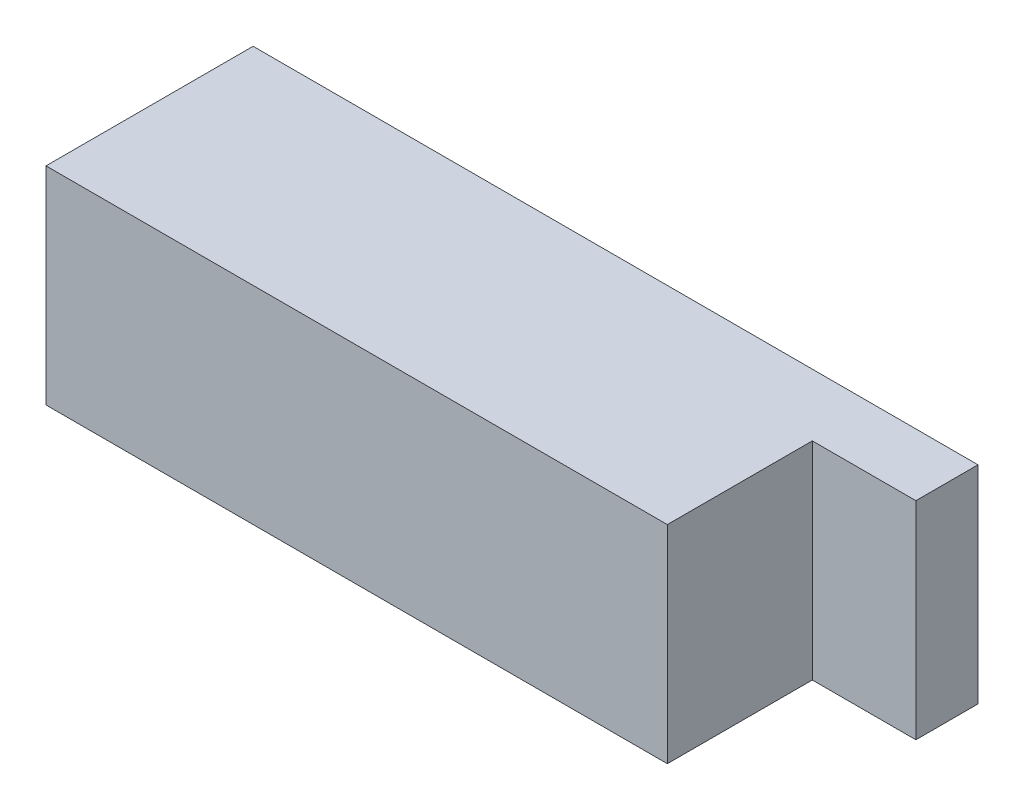
ISO-10303-21;
HEADER;
FILE_DESCRIPTION(('STEP AP214'),'2;1');
FILE_NAME('part.step','',(''),(''),'','','');
FILE_SCHEMA(('AUTOMOTIVE_DESIGN { 1 0 10303 214 1 1 1 1 }'));
ENDSEC;
DATA;
#1=APPLICATION_CONTEXT('core data for automotive mechanical design processes');
#2=APPLICATION_PROTOCOL_DEFINITION('international standard','automotive_design',2000,#1);
#3=PRODUCT_CONTEXT('',#1,'mechanical');
#4=PRODUCT('Part','Part','',(#3));
#5=PRODUCT_RELATED_PRODUCT_CATEGORY('part','',(#4));
#6=PRODUCT_DEFINITION_FORMATION('','',#4);
#7=PRODUCT_DEFINITION_CONTEXT('part definition',#1,'design');
#8=PRODUCT_DEFINITION('design','',#6,#7);
#9=PRODUCT_DEFINITION_SHAPE('','',#8);
#10=(LENGTH_UNIT() NAMED_UNIT(*) SI_UNIT(.MILLI.,.METRE.));
#11=(NAMED_UNIT(*) PLANE_ANGLE_UNIT() SI_UNIT($,.RADIAN.));
#12=(NAMED_UNIT(*) SI_UNIT($,.STERADIAN.) SOLID_ANGLE_UNIT());
#13=UNCERTAINTY_MEASURE_WITH_UNIT(LENGTH_MEASURE(1.E-05),#10,'distance_accuracy_value','');
#14=(GEOMETRIC_REPRESENTATION_CONTEXT(3) GLOBAL_UNCERTAINTY_ASSIGNED_CONTEXT((#13)) GLOBAL_UNIT_ASSIGNED_CONTEXT((#10,
#11,#12)) REPRESENTATION_CONTEXT('',''));
#15=CARTESIAN_POINT('',(0.,0.,0.));
#16=DIRECTION('',(0.,0.,1.));
#17=DIRECTION('',(1.,0.,0.));
#18=AXIS2_PLACEMENT_3D('',#15,#16,#17);
#19=CARTESIAN_POINT('',(17.5,10.,5.));
#20=DIRECTION('',(-1.,0.,0.));
#21=DIRECTION('',(0.,0.,1.));
#22=AXIS2_PLACEMENT_3D('',#19,#20,#21);
#23=PLANE('',#22);
#24=DIRECTION('',(0.,0.,-1.));
#25=VECTOR('',#24,1.);
#26=CARTESIAN_POINT('',(17.5,10.,5.));
#27=LINE('',#26,#25);
#28=CARTESIAN_POINT('',(17.5,10.,-2.));
#29=VERTEX_POINT('',#28);
#30=CARTESIAN_POINT('',(17.5,10.,-5.));
#31=VERTEX_POINT('',#30);
#32=EDGE_CURVE('E86',#29,#31,#27,.T.);
#33=ORIENTED_EDGE('',*,*,#32,.F.);
#34=DIRECTION('',(0.,1.,0.));
#35=VECTOR('',#34,1.);
#36=CARTESIAN_POINT('',(17.5,-0.000999999999999265,-2.));
#37=LINE('',#36,#35);
#38=CARTESIAN_POINT('',(17.5,0.,-2.));
#39=VERTEX_POINT('',#38);
#40=EDGE_CURVE('E140',#39,#29,#37,.T.);
#41=ORIENTED_EDGE('',*,*,#40,.F.);
#42=DIRECTION('',(0.,0.,-1.));
#43=VECTOR('',#42,1.);
#44=CARTESIAN_POINT('',(17.5,0.,5.));
#45=LINE('',#44,#43);
#46=CARTESIAN_POINT('',(17.5,0.,-5.));
#47=VERTEX_POINT('',#46);
#48=EDGE_CURVE('E135',#39,#47,#45,.T.);
#49=ORIENTED_EDGE('',*,*,#48,.T.);
#50=DIRECTION('',(0.,-1.,0.));
#51=VECTOR('',#50,1.);
#52=CARTESIAN_POINT('',(17.5,10.,-5.));
#53=LINE('',#52,#51);
#54=EDGE_CURVE('E11',#31,#47,#53,.T.);
#55=ORIENTED_EDGE('',*,*,#54,.F.);
#56=EDGE_LOOP('',(#33,#41,#49,#55));
#57=FACE_BOUND('',#56,.T.);
#58=ADVANCED_FACE('F41',(#57),#23,.F.);
#59=CARTESIAN_POINT('',(-17.5,10.,-5.));
#60=DIRECTION('',(0.,0.,1.));
#61=DIRECTION('',(1.,0.,0.));
#62=AXIS2_PLACEMENT_3D('',#59,#60,#61);
#63=PLANE('',#62);
#64=DIRECTION('',(-1.,0.,0.));
#65=VECTOR('',#64,1.);
#66=CARTESIAN_POINT('',(-17.5,0.,-5.));
#67=LINE('',#66,#65);
#68=CARTESIAN_POINT('',(-17.5,0.,-5.));
#69=VERTEX_POINT('',#68);
#70=EDGE_CURVE('E126',#47,#69,#67,.T.);
#71=ORIENTED_EDGE('',*,*,#70,.T.);
#72=DIRECTION('',(0.,-1.,0.));
#73=VECTOR('',#72,1.);
#74=CARTESIAN_POINT('',(-17.5,10.,-5.));
#75=LINE('',#74,#73);
#76=CARTESIAN_POINT('',(-17.5,10.,-5.));
#77=VERTEX_POINT('',#76);
#78=EDGE_CURVE('E48',#77,#69,#75,.T.);
#79=ORIENTED_EDGE('',*,*,#78,.F.);
#80=DIRECTION('',(-1.,0.,0.));
#81=VECTOR('',#80,1.);
#82=CARTESIAN_POINT('',(-17.5,10.,-5.));
#83=LINE('',#82,#81);
#84=EDGE_CURVE('E124',#31,#77,#83,.T.);
#85=ORIENTED_EDGE('',*,*,#84,.F.);
#86=ORIENTED_EDGE('',*,*,#54,.T.);
#87=EDGE_LOOP('',(#71,#79,#85,#86));
#88=FACE_BOUND('',#87,.T.);
#89=ADVANCED_FACE('F137',(#88),#63,.F.);
#90=CARTESIAN_POINT('',(-17.5,10.,5.));
#91=DIRECTION('',(1.,0.,0.));
#92=DIRECTION('',(0.,0.,-1.));
#93=AXIS2_PLACEMENT_3D('',#90,#91,#92);
#94=PLANE('',#93);
#95=DIRECTION('',(0.,0.,1.));
#96=VECTOR('',#95,1.);
#97=CARTESIAN_POINT('',(-17.5,0.,5.));
#98=LINE('',#97,#96);
#99=CARTESIAN_POINT('',(-17.5,0.,5.));
#100=VERTEX_POINT('',#99);
#101=EDGE_CURVE('E81',#69,#100,#98,.T.);
#102=ORIENTED_EDGE('',*,*,#101,.T.);
#103=DIRECTION('',(0.,-1.,0.));
#104=VECTOR('',#103,1.);
#105=CARTESIAN_POINT('',(-17.5,10.,5.));
#106=LINE('',#105,#104);
#107=CARTESIAN_POINT('',(-17.5,10.,5.));
#108=VERTEX_POINT('',#107);
#109=EDGE_CURVE('E122',#108,#100,#106,.T.);
#110=ORIENTED_EDGE('',*,*,#109,.F.);
#111=DIRECTION('',(0.,0.,1.));
#112=VECTOR('',#111,1.);
#113=CARTESIAN_POINT('',(-17.5,10.,5.));
#114=LINE('',#113,#112);
#115=EDGE_CURVE('E64',#77,#108,#114,.T.);
#116=ORIENTED_EDGE('',*,*,#115,.F.);
#117=ORIENTED_EDGE('',*,*,#78,.T.);
#118=EDGE_LOOP('',(#102,#110,#116,#117));
#119=FACE_BOUND('',#118,.T.);
#120=ADVANCED_FACE('F132',(#119),#94,.F.);
#121=CARTESIAN_POINT('',(-17.5,10.,5.));
#122=DIRECTION('',(0.,0.,-1.));
#123=DIRECTION('',(-1.,0.,0.));
#124=AXIS2_PLACEMENT_3D('',#121,#122,#123);
#125=PLANE('',#124);
#126=DIRECTION('',(1.,0.,0.));
#127=VECTOR('',#126,1.);
#128=CARTESIAN_POINT('',(-17.5,0.,5.));
#129=LINE('',#128,#127);
#130=CARTESIAN_POINT('',(12.5,0.,5.));
#131=VERTEX_POINT('',#130);
#132=EDGE_CURVE('E117',#100,#131,#129,.T.);
#133=ORIENTED_EDGE('',*,*,#132,.T.);
#134=DIRECTION('',(0.,1.,0.));
#135=VECTOR('',#134,1.);
#136=CARTESIAN_POINT('',(12.5,-0.000999999999999265,5.));
#137=LINE('',#136,#135);
#138=CARTESIAN_POINT('',(12.5,10.,5.));
#139=VERTEX_POINT('',#138);
#140=EDGE_CURVE('E102',#131,#139,#137,.T.);
#141=ORIENTED_EDGE('',*,*,#140,.T.);
#142=DIRECTION('',(1.,0.,0.));
#143=VECTOR('',#142,1.);
#144=CARTESIAN_POINT('',(-17.5,10.,5.));
#145=LINE('',#144,#143);
#146=EDGE_CURVE('E130',#108,#139,#145,.T.);
#147=ORIENTED_EDGE('',*,*,#146,.F.);
#148=ORIENTED_EDGE('',*,*,#109,.T.);
#149=EDGE_LOOP('',(#133,#141,#147,#148));
#150=FACE_BOUND('',#149,.T.);
#151=ADVANCED_FACE('F121',(#150),#125,.F.);
#152=CARTESIAN_POINT('',(0.,10.,0.));
#153=DIRECTION('',(0.,-1.,0.));
#154=DIRECTION('',(0.,0.,-1.));
#155=AXIS2_PLACEMENT_3D('',#152,#153,#154);
#156=PLANE('',#155);
#157=ORIENTED_EDGE('',*,*,#146,.T.);
#158=DIRECTION('',(0.,0.,1.));
#159=VECTOR('',#158,1.);
#160=CARTESIAN_POINT('',(12.5,10.,5.));
#161=LINE('',#160,#159);
#162=CARTESIAN_POINT('',(12.5,10.,-2.));
#163=VERTEX_POINT('',#162);
#164=EDGE_CURVE('E108',#163,#139,#161,.T.);
#165=ORIENTED_EDGE('',*,*,#164,.F.);
#166=DIRECTION('',(-1.,0.,0.));
#167=VECTOR('',#166,1.);
#168=CARTESIAN_POINT('',(17.5,10.,-2.));
#169=LINE('',#168,#167);
#170=EDGE_CURVE('E119',#29,#163,#169,.T.);
#171=ORIENTED_EDGE('',*,*,#170,.F.);
#172=ORIENTED_EDGE('',*,*,#32,.T.);
#173=ORIENTED_EDGE('',*,*,#84,.T.);
#174=ORIENTED_EDGE('',*,*,#115,.T.);
#175=EDGE_LOOP('',(#157,#165,#171,#172,#173,#174));
#176=FACE_BOUND('',#175,.T.);
#177=ADVANCED_FACE('F151',(#176),#156,.F.);
#178=CARTESIAN_POINT('',(0.,0.,0.));
#179=DIRECTION('',(0.,-1.,0.));
#180=DIRECTION('',(0.,0.,-1.));
#181=AXIS2_PLACEMENT_3D('',#178,#179,#180);
#182=PLANE('',#181);
#183=DIRECTION('',(0.,0.,1.));
#184=VECTOR('',#183,1.);
#185=CARTESIAN_POINT('',(12.5,0.,5.));
#186=LINE('',#185,#184);
#187=CARTESIAN_POINT('',(12.5,0.,-2.));
#188=VERTEX_POINT('',#187);
#189=EDGE_CURVE('E105',#188,#131,#186,.T.);
#190=ORIENTED_EDGE('',*,*,#189,.T.);
#191=ORIENTED_EDGE('',*,*,#132,.F.);
#192=ORIENTED_EDGE('',*,*,#101,.F.);
#193=ORIENTED_EDGE('',*,*,#70,.F.);
#194=ORIENTED_EDGE('',*,*,#48,.F.);
#195=DIRECTION('',(-1.,0.,0.));
#196=VECTOR('',#195,1.);
#197=CARTESIAN_POINT('',(17.5,0.,-2.));
#198=LINE('',#197,#196);
#199=EDGE_CURVE('E112',#39,#188,#198,.T.);
#200=ORIENTED_EDGE('',*,*,#199,.T.);
#201=EDGE_LOOP('',(#190,#191,#192,#193,#194,#200));
#202=FACE_BOUND('',#201,.T.);
#203=ADVANCED_FACE('F116',(#202),#182,.T.);
#204=CARTESIAN_POINT('',(12.5,-0.000999999999999265,5.));
#205=DIRECTION('',(-1.,0.,0.));
#206=DIRECTION('',(0.,0.,1.));
#207=AXIS2_PLACEMENT_3D('',#204,#205,#206);
#208=PLANE('',#207);
#209=DIRECTION('',(0.,1.,0.));
#210=VECTOR('',#209,1.);
#211=CARTESIAN_POINT('',(12.5,-0.000999999999999265,-2.));
#212=LINE('',#211,#210);
#213=EDGE_CURVE('E55',#188,#163,#212,.T.);
#214=ORIENTED_EDGE('',*,*,#213,.T.);
#215=ORIENTED_EDGE('',*,*,#164,.T.);
#216=ORIENTED_EDGE('',*,*,#140,.F.);
#217=ORIENTED_EDGE('',*,*,#189,.F.);
#218=EDGE_LOOP('',(#214,#215,#216,#217));
#219=FACE_BOUND('',#218,.T.);
#220=ADVANCED_FACE('F104',(#219),#208,.F.);
#221=CARTESIAN_POINT('',(17.5,-0.000999999999999265,-2.));
#222=DIRECTION('',(0.,0.,-1.));
#223=DIRECTION('',(-1.,0.,0.));
#224=AXIS2_PLACEMENT_3D('',#221,#222,#223);
#225=PLANE('',#224);
#226=ORIENTED_EDGE('',*,*,#40,.T.);
#227=ORIENTED_EDGE('',*,*,#170,.T.);
#228=ORIENTED_EDGE('',*,*,#213,.F.);
#229=ORIENTED_EDGE('',*,*,#199,.F.);
#230=EDGE_LOOP('',(#226,#227,#228,#229));
#231=FACE_BOUND('',#230,.T.);
#232=ADVANCED_FACE('F150',(#231),#225,.F.);
#233=CLOSED_SHELL('',(#58,#89,#120,#151,#177,#203,#220,#232));
#234=MANIFOLD_SOLID_BREP('B2',#233);
#235=ADVANCED_BREP_SHAPE_REPRESENTATION('',(#18,#234),#14);
#236=SHAPE_DEFINITION_REPRESENTATION(#9,#235);
ENDSEC;
END-ISO-10303-21;
